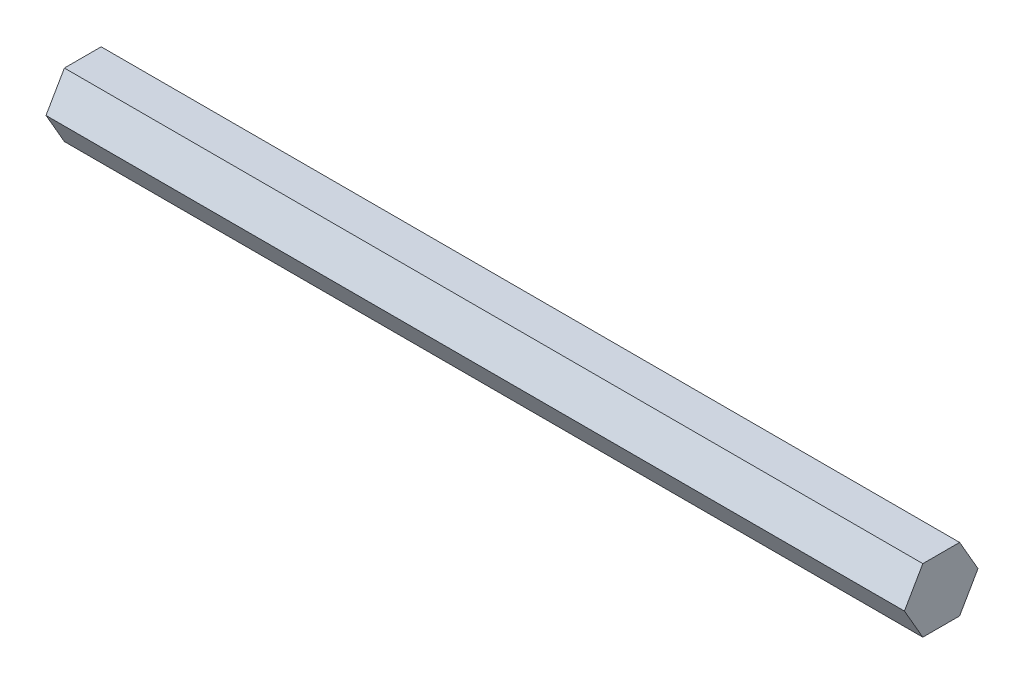
ISO-10303-21;
HEADER;
FILE_DESCRIPTION(('STEP AP214'),'2;1');
FILE_NAME('part.step','',(''),(''),'','','');
FILE_SCHEMA(('AUTOMOTIVE_DESIGN { 1 0 10303 214 1 1 1 1 }'));
ENDSEC;
DATA;
#1=APPLICATION_CONTEXT('core data for automotive mechanical design processes');
#2=APPLICATION_PROTOCOL_DEFINITION('international standard','automotive_design',2000,#1);
#3=PRODUCT_CONTEXT('',#1,'mechanical');
#4=PRODUCT('Part','Part','',(#3));
#5=PRODUCT_RELATED_PRODUCT_CATEGORY('part','',(#4));
#6=PRODUCT_DEFINITION_FORMATION('','',#4);
#7=PRODUCT_DEFINITION_CONTEXT('part definition',#1,'design');
#8=PRODUCT_DEFINITION('design','',#6,#7);
#9=PRODUCT_DEFINITION_SHAPE('','',#8);
#10=(LENGTH_UNIT() NAMED_UNIT(*) SI_UNIT(.MILLI.,.METRE.));
#11=(NAMED_UNIT(*) PLANE_ANGLE_UNIT() SI_UNIT($,.RADIAN.));
#12=(NAMED_UNIT(*) SI_UNIT($,.STERADIAN.) SOLID_ANGLE_UNIT());
#13=UNCERTAINTY_MEASURE_WITH_UNIT(LENGTH_MEASURE(1.E-05),#10,'distance_accuracy_value','');
#14=(GEOMETRIC_REPRESENTATION_CONTEXT(3) GLOBAL_UNCERTAINTY_ASSIGNED_CONTEXT((#13)) GLOBAL_UNIT_ASSIGNED_CONTEXT((#10,
#11,#12)) REPRESENTATION_CONTEXT('',''));
#15=CARTESIAN_POINT('',(0.,0.,0.));
#16=DIRECTION('',(0.,0.,1.));
#17=DIRECTION('',(1.,0.,0.));
#18=AXIS2_PLACEMENT_3D('',#15,#16,#17);
#19=CARTESIAN_POINT('',(171.45,-6.3627,3.67350655777283));
#20=DIRECTION('',(0.,0.5,-0.866025403784439));
#21=DIRECTION('',(0.,-0.866025403784439,-0.5));
#22=AXIS2_PLACEMENT_3D('',#19,#20,#21);
#23=PLANE('',#22);
#24=DIRECTION('',(0.,0.866025403784439,0.5));
#25=VECTOR('',#24,1.);
#26=CARTESIAN_POINT('',(0.,-6.3627,3.67350655777283));
#27=LINE('',#26,#25);
#28=CARTESIAN_POINT('',(0.,-6.3627,3.67350655777283));
#29=VERTEX_POINT('',#28);
#30=CARTESIAN_POINT('',(0.,0.,7.34701311554566));
#31=VERTEX_POINT('',#30);
#32=EDGE_CURVE('E116',#29,#31,#27,.T.);
#33=ORIENTED_EDGE('',*,*,#32,.F.);
#34=DIRECTION('',(-1.,0.,0.));
#35=VECTOR('',#34,1.);
#36=CARTESIAN_POINT('',(171.45,-6.3627,3.67350655777283));
#37=LINE('',#36,#35);
#38=CARTESIAN_POINT('',(171.45,-6.3627,3.67350655777283));
#39=VERTEX_POINT('',#38);
#40=EDGE_CURVE('E115',#39,#29,#37,.T.);
#41=ORIENTED_EDGE('',*,*,#40,.F.);
#42=DIRECTION('',(0.,0.866025403784439,0.5));
#43=VECTOR('',#42,1.);
#44=CARTESIAN_POINT('',(171.45,-6.3627,3.67350655777283));
#45=LINE('',#44,#43);
#46=CARTESIAN_POINT('',(171.45,0.,7.34701311554566));
#47=VERTEX_POINT('',#46);
#48=EDGE_CURVE('E128',#39,#47,#45,.T.);
#49=ORIENTED_EDGE('',*,*,#48,.T.);
#50=DIRECTION('',(-1.,0.,0.));
#51=VECTOR('',#50,1.);
#52=CARTESIAN_POINT('',(171.45,0.,7.34701311554566));
#53=LINE('',#52,#51);
#54=EDGE_CURVE('E11',#47,#31,#53,.T.);
#55=ORIENTED_EDGE('',*,*,#54,.T.);
#56=EDGE_LOOP('',(#33,#41,#49,#55));
#57=FACE_BOUND('',#56,.T.);
#58=ADVANCED_FACE('F33',(#57),#23,.F.);
#59=CARTESIAN_POINT('',(171.45,0.,7.34701311554566));
#60=DIRECTION('',(0.,-0.5,-0.866025403784439));
#61=DIRECTION('',(0.,-0.866025403784439,0.5));
#62=AXIS2_PLACEMENT_3D('',#59,#60,#61);
#63=PLANE('',#62);
#64=DIRECTION('',(0.,0.866025403784439,-0.5));
#65=VECTOR('',#64,1.);
#66=CARTESIAN_POINT('',(0.,0.,7.34701311554566));
#67=LINE('',#66,#65);
#68=CARTESIAN_POINT('',(0.,6.3627,3.67350655777283));
#69=VERTEX_POINT('',#68);
#70=EDGE_CURVE('E118',#31,#69,#67,.T.);
#71=ORIENTED_EDGE('',*,*,#70,.F.);
#72=ORIENTED_EDGE('',*,*,#54,.F.);
#73=DIRECTION('',(0.,0.866025403784439,-0.5));
#74=VECTOR('',#73,1.);
#75=CARTESIAN_POINT('',(171.45,0.,7.34701311554566));
#76=LINE('',#75,#74);
#77=CARTESIAN_POINT('',(171.45,6.3627,3.67350655777283));
#78=VERTEX_POINT('',#77);
#79=EDGE_CURVE('E81',#47,#78,#76,.T.);
#80=ORIENTED_EDGE('',*,*,#79,.T.);
#81=DIRECTION('',(-1.,0.,0.));
#82=VECTOR('',#81,1.);
#83=CARTESIAN_POINT('',(171.45,6.3627,3.67350655777283));
#84=LINE('',#83,#82);
#85=EDGE_CURVE('E41',#78,#69,#84,.T.);
#86=ORIENTED_EDGE('',*,*,#85,.T.);
#87=EDGE_LOOP('',(#71,#72,#80,#86));
#88=FACE_BOUND('',#87,.T.);
#89=ADVANCED_FACE('F134',(#88),#63,.F.);
#90=CARTESIAN_POINT('',(171.45,6.3627,3.67350655777283));
#91=DIRECTION('',(0.,-1.,0.));
#92=DIRECTION('',(0.,0.,1.));
#93=AXIS2_PLACEMENT_3D('',#90,#91,#92);
#94=PLANE('',#93);
#95=DIRECTION('',(0.,0.,-1.));
#96=VECTOR('',#95,1.);
#97=CARTESIAN_POINT('',(0.,6.3627,3.67350655777283));
#98=LINE('',#97,#96);
#99=CARTESIAN_POINT('',(0.,6.3627,-3.67350655777283));
#100=VERTEX_POINT('',#99);
#101=EDGE_CURVE('E121',#69,#100,#98,.T.);
#102=ORIENTED_EDGE('',*,*,#101,.F.);
#103=ORIENTED_EDGE('',*,*,#85,.F.);
#104=DIRECTION('',(0.,0.,-1.));
#105=VECTOR('',#104,1.);
#106=CARTESIAN_POINT('',(171.45,6.3627,3.67350655777283));
#107=LINE('',#106,#105);
#108=CARTESIAN_POINT('',(171.45,6.3627,-3.67350655777283));
#109=VERTEX_POINT('',#108);
#110=EDGE_CURVE('E109',#78,#109,#107,.T.);
#111=ORIENTED_EDGE('',*,*,#110,.T.);
#112=DIRECTION('',(-1.,0.,0.));
#113=VECTOR('',#112,1.);
#114=CARTESIAN_POINT('',(171.45,6.3627,-3.67350655777283));
#115=LINE('',#114,#113);
#116=EDGE_CURVE('E103',#109,#100,#115,.T.);
#117=ORIENTED_EDGE('',*,*,#116,.T.);
#118=EDGE_LOOP('',(#102,#103,#111,#117));
#119=FACE_BOUND('',#118,.T.);
#120=ADVANCED_FACE('F156',(#119),#94,.F.);
#121=CARTESIAN_POINT('',(171.45,6.3627,-3.67350655777283));
#122=DIRECTION('',(0.,-0.5,0.866025403784439));
#123=DIRECTION('',(0.,0.866025403784439,0.5));
#124=AXIS2_PLACEMENT_3D('',#121,#122,#123);
#125=PLANE('',#124);
#126=DIRECTION('',(0.,-0.866025403784439,-0.5));
#127=VECTOR('',#126,1.);
#128=CARTESIAN_POINT('',(0.,6.3627,-3.67350655777283));
#129=LINE('',#128,#127);
#130=CARTESIAN_POINT('',(0.,0.,-7.34701311554567));
#131=VERTEX_POINT('',#130);
#132=EDGE_CURVE('E124',#100,#131,#129,.T.);
#133=ORIENTED_EDGE('',*,*,#132,.F.);
#134=ORIENTED_EDGE('',*,*,#116,.F.);
#135=DIRECTION('',(0.,-0.866025403784439,-0.5));
#136=VECTOR('',#135,1.);
#137=CARTESIAN_POINT('',(171.45,6.3627,-3.67350655777283));
#138=LINE('',#137,#136);
#139=CARTESIAN_POINT('',(171.45,0.,-7.34701311554567));
#140=VERTEX_POINT('',#139);
#141=EDGE_CURVE('E93',#109,#140,#138,.T.);
#142=ORIENTED_EDGE('',*,*,#141,.T.);
#143=DIRECTION('',(-1.,0.,0.));
#144=VECTOR('',#143,1.);
#145=CARTESIAN_POINT('',(171.45,0.,-7.34701311554567));
#146=LINE('',#145,#144);
#147=EDGE_CURVE('E98',#140,#131,#146,.T.);
#148=ORIENTED_EDGE('',*,*,#147,.T.);
#149=EDGE_LOOP('',(#133,#134,#142,#148));
#150=FACE_BOUND('',#149,.T.);
#151=ADVANCED_FACE('F106',(#150),#125,.F.);
#152=CARTESIAN_POINT('',(171.45,0.,-7.34701311554567));
#153=DIRECTION('',(0.,0.5,0.866025403784439));
#154=DIRECTION('',(0.,0.866025403784439,-0.5));
#155=AXIS2_PLACEMENT_3D('',#152,#153,#154);
#156=PLANE('',#155);
#157=DIRECTION('',(0.,-0.866025403784439,0.5));
#158=VECTOR('',#157,1.);
#159=CARTESIAN_POINT('',(0.,0.,-7.34701311554567));
#160=LINE('',#159,#158);
#161=CARTESIAN_POINT('',(0.,-6.3627,-3.67350655777283));
#162=VERTEX_POINT('',#161);
#163=EDGE_CURVE('E100',#131,#162,#160,.T.);
#164=ORIENTED_EDGE('',*,*,#163,.F.);
#165=ORIENTED_EDGE('',*,*,#147,.F.);
#166=DIRECTION('',(0.,-0.866025403784439,0.5));
#167=VECTOR('',#166,1.);
#168=CARTESIAN_POINT('',(171.45,0.,-7.34701311554567));
#169=LINE('',#168,#167);
#170=CARTESIAN_POINT('',(171.45,-6.3627,-3.67350655777283));
#171=VERTEX_POINT('',#170);
#172=EDGE_CURVE('E89',#140,#171,#169,.T.);
#173=ORIENTED_EDGE('',*,*,#172,.T.);
#174=DIRECTION('',(-1.,0.,0.));
#175=VECTOR('',#174,1.);
#176=CARTESIAN_POINT('',(171.45,-6.3627,-3.67350655777283));
#177=LINE('',#176,#175);
#178=EDGE_CURVE('E104',#171,#162,#177,.T.);
#179=ORIENTED_EDGE('',*,*,#178,.T.);
#180=EDGE_LOOP('',(#164,#165,#173,#179));
#181=FACE_BOUND('',#180,.T.);
#182=ADVANCED_FACE('F99',(#181),#156,.F.);
#183=CARTESIAN_POINT('',(171.45,-6.3627,-3.67350655777283));
#184=DIRECTION('',(0.,1.,0.));
#185=DIRECTION('',(0.,0.,-1.));
#186=AXIS2_PLACEMENT_3D('',#183,#184,#185);
#187=PLANE('',#186);
#188=DIRECTION('',(0.,0.,1.));
#189=VECTOR('',#188,1.);
#190=CARTESIAN_POINT('',(0.,-6.3627,-3.67350655777283));
#191=LINE('',#190,#189);
#192=EDGE_CURVE('E69',#162,#29,#191,.T.);
#193=ORIENTED_EDGE('',*,*,#192,.F.);
#194=ORIENTED_EDGE('',*,*,#178,.F.);
#195=DIRECTION('',(0.,0.,1.));
#196=VECTOR('',#195,1.);
#197=CARTESIAN_POINT('',(171.45,-6.3627,-3.67350655777283));
#198=LINE('',#197,#196);
#199=EDGE_CURVE('E49',#171,#39,#198,.T.);
#200=ORIENTED_EDGE('',*,*,#199,.T.);
#201=ORIENTED_EDGE('',*,*,#40,.T.);
#202=EDGE_LOOP('',(#193,#194,#200,#201));
#203=FACE_BOUND('',#202,.T.);
#204=ADVANCED_FACE('F142',(#203),#187,.F.);
#205=CARTESIAN_POINT('',(171.45,0.,0.));
#206=DIRECTION('',(1.,0.,0.));
#207=DIRECTION('',(0.,0.,1.));
#208=AXIS2_PLACEMENT_3D('',#205,#206,#207);
#209=PLANE('',#208);
#210=ORIENTED_EDGE('',*,*,#48,.F.);
#211=ORIENTED_EDGE('',*,*,#199,.F.);
#212=ORIENTED_EDGE('',*,*,#172,.F.);
#213=ORIENTED_EDGE('',*,*,#141,.F.);
#214=ORIENTED_EDGE('',*,*,#110,.F.);
#215=ORIENTED_EDGE('',*,*,#79,.F.);
#216=EDGE_LOOP('',(#210,#211,#212,#213,#214,#215));
#217=FACE_BOUND('',#216,.T.);
#218=ADVANCED_FACE('F91',(#217),#209,.T.);
#219=CARTESIAN_POINT('',(0.,0.,0.));
#220=DIRECTION('',(1.,0.,0.));
#221=DIRECTION('',(0.,0.,1.));
#222=AXIS2_PLACEMENT_3D('',#219,#220,#221);
#223=PLANE('',#222);
#224=ORIENTED_EDGE('',*,*,#32,.T.);
#225=ORIENTED_EDGE('',*,*,#70,.T.);
#226=ORIENTED_EDGE('',*,*,#101,.T.);
#227=ORIENTED_EDGE('',*,*,#132,.T.);
#228=ORIENTED_EDGE('',*,*,#163,.T.);
#229=ORIENTED_EDGE('',*,*,#192,.T.);
#230=EDGE_LOOP('',(#224,#225,#226,#227,#228,#229));
#231=FACE_BOUND('',#230,.T.);
#232=ADVANCED_FACE('F136',(#231),#223,.F.);
#233=CLOSED_SHELL('',(#58,#89,#120,#151,#182,#204,#218,#232));
#234=MANIFOLD_SOLID_BREP('B2',#233);
#235=ADVANCED_BREP_SHAPE_REPRESENTATION('',(#18,#234),#14);
#236=SHAPE_DEFINITION_REPRESENTATION(#9,#235);
ENDSEC;
END-ISO-10303-21;
